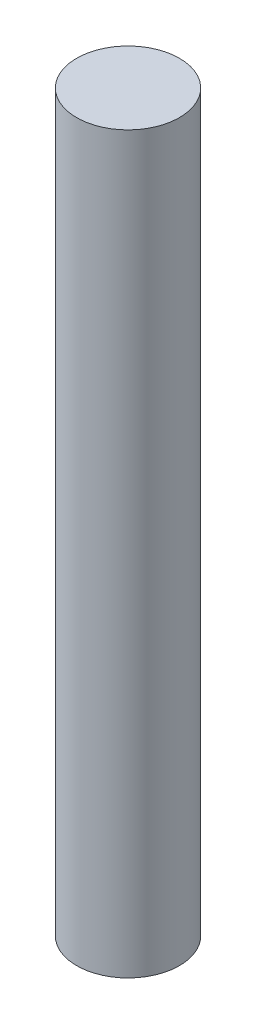
ISO-10303-21;
HEADER;
FILE_DESCRIPTION(('STEP AP214'),'2;1');
FILE_NAME('part.step','',(''),(''),'','','');
FILE_SCHEMA(('AUTOMOTIVE_DESIGN { 1 0 10303 214 1 1 1 1 }'));
ENDSEC;
DATA;
#1=APPLICATION_CONTEXT('core data for automotive mechanical design processes');
#2=APPLICATION_PROTOCOL_DEFINITION('international standard','automotive_design',2000,#1);
#3=PRODUCT_CONTEXT('',#1,'mechanical');
#4=PRODUCT('Part','Part','',(#3));
#5=PRODUCT_RELATED_PRODUCT_CATEGORY('part','',(#4));
#6=PRODUCT_DEFINITION_FORMATION('','',#4);
#7=PRODUCT_DEFINITION_CONTEXT('part definition',#1,'design');
#8=PRODUCT_DEFINITION('design','',#6,#7);
#9=PRODUCT_DEFINITION_SHAPE('','',#8);
#10=(LENGTH_UNIT() NAMED_UNIT(*) SI_UNIT(.MILLI.,.METRE.));
#11=(NAMED_UNIT(*) PLANE_ANGLE_UNIT() SI_UNIT($,.RADIAN.));
#12=(NAMED_UNIT(*) SI_UNIT($,.STERADIAN.) SOLID_ANGLE_UNIT());
#13=UNCERTAINTY_MEASURE_WITH_UNIT(LENGTH_MEASURE(1.E-05),#10,'distance_accuracy_value','');
#14=(GEOMETRIC_REPRESENTATION_CONTEXT(3) GLOBAL_UNCERTAINTY_ASSIGNED_CONTEXT((#13)) GLOBAL_UNIT_ASSIGNED_CONTEXT((#10,
#11,#12)) REPRESENTATION_CONTEXT('',''));
#15=CARTESIAN_POINT('',(0.,0.,0.));
#16=DIRECTION('',(0.,0.,1.));
#17=DIRECTION('',(1.,0.,0.));
#18=AXIS2_PLACEMENT_3D('',#15,#16,#17);
#19=CARTESIAN_POINT('',(0.,152.4,0.));
#20=DIRECTION('',(0.,-1.,0.));
#21=DIRECTION('',(0.,0.,-1.));
#22=AXIS2_PLACEMENT_3D('',#19,#20,#21);
#23=CYLINDRICAL_SURFACE('',#22,10.668);
#24=CARTESIAN_POINT('',(0.,152.4,0.));
#25=DIRECTION('',(0.,1.,0.));
#26=DIRECTION('',(0.,0.,1.));
#27=AXIS2_PLACEMENT_3D('',#24,#25,#26);
#28=CIRCLE('',#27,10.668);
#29=CARTESIAN_POINT('',(0.,152.4,-10.668));
#30=VERTEX_POINT('',#29);
#31=EDGE_CURVE('E10',#30,#30,#28,.T.);
#32=CARTESIAN_POINT('',(0.,0.,0.));
#33=DIRECTION('',(0.,1.,0.));
#34=DIRECTION('',(0.,0.,1.));
#35=AXIS2_PLACEMENT_3D('',#32,#33,#34);
#36=CIRCLE('',#35,10.668);
#37=CARTESIAN_POINT('',(0.,0.,-10.668));
#38=VERTEX_POINT('',#37);
#39=EDGE_CURVE('E33',#38,#38,#36,.T.);
#40=CARTESIAN_POINT('',(0.,152.4,-10.668));
#41=CARTESIAN_POINT('',(0.,150.8125,-10.668));
#42=CARTESIAN_POINT('',(0.,149.225,-10.668));
#43=CARTESIAN_POINT('',(0.,146.05,-10.668));
#44=CARTESIAN_POINT('',(0.,144.4625,-10.668));
#45=CARTESIAN_POINT('',(0.,141.2875,-10.668));
#46=CARTESIAN_POINT('',(0.,139.7,-10.668));
#47=CARTESIAN_POINT('',(0.,136.525,-10.668));
#48=CARTESIAN_POINT('',(0.,134.9375,-10.668));
#49=CARTESIAN_POINT('',(0.,131.7625,-10.668));
#50=CARTESIAN_POINT('',(0.,130.175,-10.668));
#51=CARTESIAN_POINT('',(0.,127.,-10.668));
#52=CARTESIAN_POINT('',(0.,125.4125,-10.668));
#53=CARTESIAN_POINT('',(0.,122.2375,-10.668));
#54=CARTESIAN_POINT('',(0.,120.65,-10.668));
#55=CARTESIAN_POINT('',(0.,117.475,-10.668));
#56=CARTESIAN_POINT('',(0.,115.8875,-10.668));
#57=CARTESIAN_POINT('',(0.,112.7125,-10.668));
#58=CARTESIAN_POINT('',(0.,111.125,-10.668));
#59=CARTESIAN_POINT('',(0.,107.95,-10.668));
#60=CARTESIAN_POINT('',(0.,106.3625,-10.668));
#61=CARTESIAN_POINT('',(0.,103.1875,-10.668));
#62=CARTESIAN_POINT('',(0.,101.6,-10.668));
#63=CARTESIAN_POINT('',(0.,98.425,-10.668));
#64=CARTESIAN_POINT('',(0.,96.8375,-10.668));
#65=CARTESIAN_POINT('',(0.,93.6625,-10.668));
#66=CARTESIAN_POINT('',(0.,92.075,-10.668));
#67=CARTESIAN_POINT('',(0.,88.9,-10.668));
#68=CARTESIAN_POINT('',(0.,87.3125,-10.668));
#69=CARTESIAN_POINT('',(0.,84.1375,-10.668));
#70=CARTESIAN_POINT('',(0.,82.55,-10.668));
#71=CARTESIAN_POINT('',(0.,79.375,-10.668));
#72=CARTESIAN_POINT('',(0.,77.7875,-10.668));
#73=CARTESIAN_POINT('',(0.,74.6125,-10.668));
#74=CARTESIAN_POINT('',(0.,73.025,-10.668));
#75=CARTESIAN_POINT('',(0.,69.85,-10.668));
#76=CARTESIAN_POINT('',(0.,68.2625,-10.668));
#77=CARTESIAN_POINT('',(0.,65.0875,-10.668));
#78=CARTESIAN_POINT('',(0.,63.5,-10.668));
#79=CARTESIAN_POINT('',(0.,60.325,-10.668));
#80=CARTESIAN_POINT('',(0.,58.7375,-10.668));
#81=CARTESIAN_POINT('',(0.,55.5625,-10.668));
#82=CARTESIAN_POINT('',(0.,53.975,-10.668));
#83=CARTESIAN_POINT('',(0.,50.8,-10.668));
#84=CARTESIAN_POINT('',(0.,49.2125,-10.668));
#85=CARTESIAN_POINT('',(0.,46.0375,-10.668));
#86=CARTESIAN_POINT('',(0.,44.45,-10.668));
#87=CARTESIAN_POINT('',(0.,41.275,-10.668));
#88=CARTESIAN_POINT('',(0.,39.6875,-10.668));
#89=CARTESIAN_POINT('',(0.,36.5125,-10.668));
#90=CARTESIAN_POINT('',(0.,34.925,-10.668));
#91=CARTESIAN_POINT('',(0.,31.75,-10.668));
#92=CARTESIAN_POINT('',(0.,30.1625,-10.668));
#93=CARTESIAN_POINT('',(0.,26.9875,-10.668));
#94=CARTESIAN_POINT('',(0.,25.4,-10.668));
#95=CARTESIAN_POINT('',(0.,22.225,-10.668));
#96=CARTESIAN_POINT('',(0.,20.6375,-10.668));
#97=CARTESIAN_POINT('',(0.,17.4625,-10.668));
#98=CARTESIAN_POINT('',(0.,15.875,-10.668));
#99=CARTESIAN_POINT('',(0.,12.7,-10.668));
#100=CARTESIAN_POINT('',(0.,11.1125,-10.668));
#101=CARTESIAN_POINT('',(0.,7.93750000000001,-10.668));
#102=CARTESIAN_POINT('',(0.,6.35,-10.668));
#103=CARTESIAN_POINT('',(0.,3.175,-10.668));
#104=CARTESIAN_POINT('',(0.,1.5875,-10.668));
#105=CARTESIAN_POINT('',(0.,0.,-10.668));
#106=B_SPLINE_CURVE_WITH_KNOTS('',3,(#40,#41,#42,#43,#44,#45,#46,#47,#48,#49,#50,#51,#52,#53,
#54,#55,#56,#57,#58,#59,#60,#61,#62,#63,#64,#65,#66,#67,#68,#69,#70,#71,#72,#73,#74,#75,#76,#77,
#78,#79,#80,#81,#82,#83,#84,#85,#86,#87,#88,#89,#90,#91,#92,#93,#94,#95,#96,#97,#98,#99,#100,
#101,#102,#103,#104,#105),.UNSPECIFIED.,.F.,.F.,(4,2,2,2,2,2,2,2,2,2,2,2,2,2,2,2,2,2,2,2,2,2,2,
2,2,2,2,2,2,2,2,2,4),(0.,4.76249999999998,9.52499999999998,14.2875,19.05,23.8125,28.575,33.3375,
38.1,42.8625,47.625,52.3875,57.15,61.9125,66.675,71.4375,76.2,80.9625,85.725,90.4875,95.25,
100.0125,104.775,109.5375,114.3,119.0625,123.825,128.5875,133.35,138.1125,142.875,147.6375,
152.4),.UNSPECIFIED.);
#107=EDGE_CURVE('BSEAM30',#30,#38,#106,.T.);
#108=ORIENTED_EDGE('',*,*,#31,.F.);
#109=ORIENTED_EDGE('',*,*,#39,.T.);
#110=ORIENTED_EDGE('',*,*,#107,.T.);
#111=ORIENTED_EDGE('',*,*,#107,.F.);
#112=EDGE_LOOP('',(#108,#110,#109,#111));
#113=FACE_BOUND('',#112,.T.);
#114=ADVANCED_FACE('F30',(#113),#23,.T.);
#115=CARTESIAN_POINT('',(0.,152.4,0.));
#116=DIRECTION('',(0.,1.,0.));
#117=DIRECTION('',(0.,0.,1.));
#118=AXIS2_PLACEMENT_3D('',#115,#116,#117);
#119=PLANE('',#118);
#120=ORIENTED_EDGE('',*,*,#31,.T.);
#121=EDGE_LOOP('',(#120));
#122=FACE_BOUND('',#121,.T.);
#123=ADVANCED_FACE('F45',(#122),#119,.T.);
#124=CARTESIAN_POINT('',(0.,0.,0.));
#125=DIRECTION('',(0.,1.,0.));
#126=DIRECTION('',(0.,0.,1.));
#127=AXIS2_PLACEMENT_3D('',#124,#125,#126);
#128=PLANE('',#127);
#129=ORIENTED_EDGE('',*,*,#39,.F.);
#130=EDGE_LOOP('',(#129));
#131=FACE_BOUND('',#130,.T.);
#132=ADVANCED_FACE('F43',(#131),#128,.F.);
#133=CLOSED_SHELL('',(#114,#123,#132));
#134=MANIFOLD_SOLID_BREP('B2',#133);
#135=ADVANCED_BREP_SHAPE_REPRESENTATION('',(#18,#134),#14);
#136=SHAPE_DEFINITION_REPRESENTATION(#9,#135);
ENDSEC;
END-ISO-10303-21;
